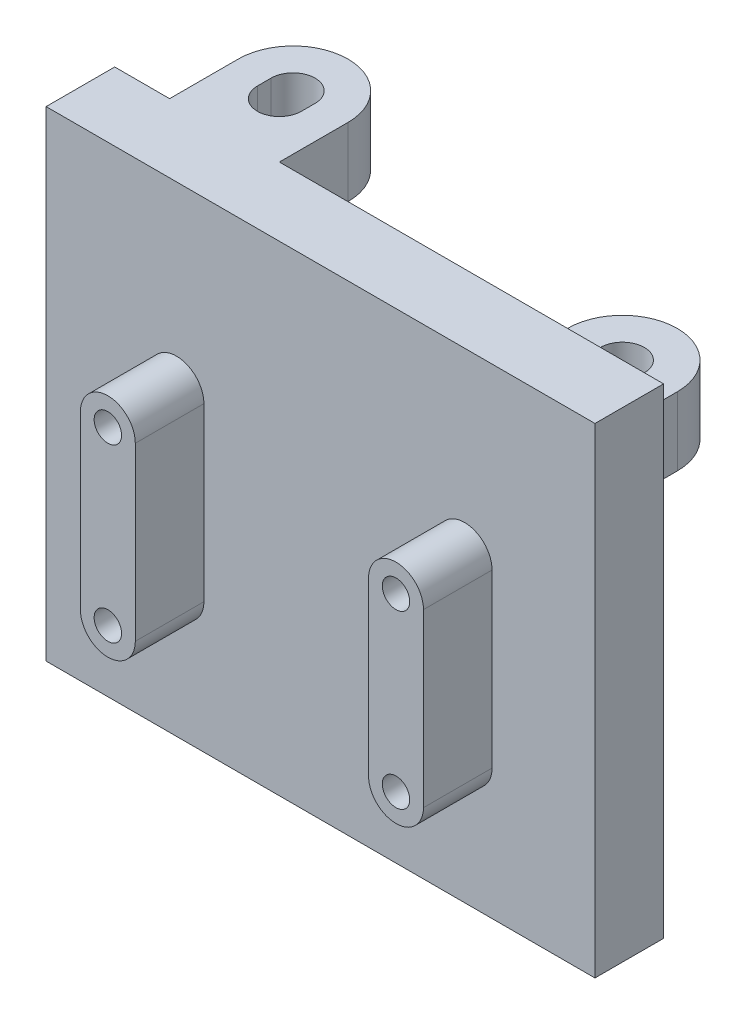
ISO-10303-21;
HEADER;
FILE_DESCRIPTION(('STEP AP214'),'2;1');
FILE_NAME('part.step','',(''),(''),'','','');
FILE_SCHEMA(('AUTOMOTIVE_DESIGN { 1 0 10303 214 1 1 1 1 }'));
ENDSEC;
DATA;
#1=APPLICATION_CONTEXT('core data for automotive mechanical design processes');
#2=APPLICATION_PROTOCOL_DEFINITION('international standard','automotive_design',2000,#1);
#3=PRODUCT_CONTEXT('',#1,'mechanical');
#4=PRODUCT('Part','Part','',(#3));
#5=PRODUCT_RELATED_PRODUCT_CATEGORY('part','',(#4));
#6=PRODUCT_DEFINITION_FORMATION('','',#4);
#7=PRODUCT_DEFINITION_CONTEXT('part definition',#1,'design');
#8=PRODUCT_DEFINITION('design','',#6,#7);
#9=PRODUCT_DEFINITION_SHAPE('','',#8);
#10=(LENGTH_UNIT() NAMED_UNIT(*) SI_UNIT(.MILLI.,.METRE.));
#11=(NAMED_UNIT(*) PLANE_ANGLE_UNIT() SI_UNIT($,.RADIAN.));
#12=(NAMED_UNIT(*) SI_UNIT($,.STERADIAN.) SOLID_ANGLE_UNIT());
#13=UNCERTAINTY_MEASURE_WITH_UNIT(LENGTH_MEASURE(1.E-05),#10,'distance_accuracy_value','');
#14=(GEOMETRIC_REPRESENTATION_CONTEXT(3) GLOBAL_UNCERTAINTY_ASSIGNED_CONTEXT((#13)) GLOBAL_UNIT_ASSIGNED_CONTEXT((#10,
#11,#12)) REPRESENTATION_CONTEXT('',''));
#15=CARTESIAN_POINT('',(0.,0.,0.));
#16=DIRECTION('',(0.,0.,1.));
#17=DIRECTION('',(1.,0.,0.));
#18=AXIS2_PLACEMENT_3D('',#15,#16,#17);
#19=CARTESIAN_POINT('',(0.,5.,5.));
#20=DIRECTION('',(0.,0.,1.));
#21=DIRECTION('',(1.,0.,0.));
#22=AXIS2_PLACEMENT_3D('',#19,#20,#21);
#23=PLANE('',#22);
#24=CARTESIAN_POINT('',(10.5,-20.5,5.));
#25=DIRECTION('',(0.,0.,1.));
#26=DIRECTION('',(1.,0.,0.));
#27=AXIS2_PLACEMENT_3D('',#24,#25,#26);
#28=CIRCLE('',#27,2.);
#29=CARTESIAN_POINT('',(12.5,-20.5,5.));
#30=VERTEX_POINT('',#29);
#31=CARTESIAN_POINT('',(8.5,-20.5,5.));
#32=VERTEX_POINT('',#31);
#33=EDGE_CURVE('E229',#30,#32,#28,.F.);
#34=ORIENTED_EDGE('',*,*,#33,.T.);
#35=DIRECTION('',(0.,-1.,0.));
#36=VECTOR('',#35,1.);
#37=CARTESIAN_POINT('',(8.50000000000001,0.,5.));
#38=LINE('',#37,#36);
#39=CARTESIAN_POINT('',(8.50000000000001,-8.,5.));
#40=VERTEX_POINT('',#39);
#41=EDGE_CURVE('E247',#40,#32,#38,.T.);
#42=ORIENTED_EDGE('',*,*,#41,.F.);
#43=CARTESIAN_POINT('',(10.5,-8.,5.));
#44=DIRECTION('',(0.,0.,1.));
#45=DIRECTION('',(1.,0.,0.));
#46=AXIS2_PLACEMENT_3D('',#43,#44,#45);
#47=CIRCLE('',#46,2.);
#48=CARTESIAN_POINT('',(12.5,-8.,5.));
#49=VERTEX_POINT('',#48);
#50=EDGE_CURVE('E55',#40,#49,#47,.F.);
#51=ORIENTED_EDGE('',*,*,#50,.T.);
#52=DIRECTION('',(0.,-1.,0.));
#53=VECTOR('',#52,1.);
#54=CARTESIAN_POINT('',(12.5,0.,5.));
#55=LINE('',#54,#53);
#56=EDGE_CURVE('E263',#49,#30,#55,.T.);
#57=ORIENTED_EDGE('',*,*,#56,.T.);
#58=EDGE_LOOP('',(#34,#42,#51,#57));
#59=FACE_BOUND('',#58,.T.);
#60=CARTESIAN_POINT('',(-10.5,-20.5,5.));
#61=DIRECTION('',(0.,0.,1.));
#62=DIRECTION('',(1.,0.,0.));
#63=AXIS2_PLACEMENT_3D('',#60,#61,#62);
#64=CIRCLE('',#63,2.);
#65=CARTESIAN_POINT('',(-12.5,-20.5,5.));
#66=VERTEX_POINT('',#65);
#67=CARTESIAN_POINT('',(-8.49999999999999,-20.5,5.));
#68=VERTEX_POINT('',#67);
#69=EDGE_CURVE('E292',#66,#68,#64,.T.);
#70=ORIENTED_EDGE('',*,*,#69,.F.);
#71=DIRECTION('',(0.,-1.,0.));
#72=VECTOR('',#71,1.);
#73=CARTESIAN_POINT('',(-12.5,0.,5.));
#74=LINE('',#73,#72);
#75=CARTESIAN_POINT('',(-12.5,-8.,5.));
#76=VERTEX_POINT('',#75);
#77=EDGE_CURVE('E234',#76,#66,#74,.T.);
#78=ORIENTED_EDGE('',*,*,#77,.F.);
#79=CARTESIAN_POINT('',(-10.5,-8.,5.));
#80=DIRECTION('',(0.,0.,1.));
#81=DIRECTION('',(1.,0.,0.));
#82=AXIS2_PLACEMENT_3D('',#79,#80,#81);
#83=CIRCLE('',#82,2.);
#84=CARTESIAN_POINT('',(-8.5,-8.,5.));
#85=VERTEX_POINT('',#84);
#86=EDGE_CURVE('E276',#85,#76,#83,.T.);
#87=ORIENTED_EDGE('',*,*,#86,.F.);
#88=DIRECTION('',(0.,-1.,0.));
#89=VECTOR('',#88,1.);
#90=CARTESIAN_POINT('',(-8.5,0.,5.));
#91=LINE('',#90,#89);
#92=EDGE_CURVE('E63',#85,#68,#91,.T.);
#93=ORIENTED_EDGE('',*,*,#92,.T.);
#94=EDGE_LOOP('',(#70,#78,#87,#93));
#95=FACE_BOUND('',#94,.T.);
#96=DIRECTION('',(-1.,0.,0.));
#97=VECTOR('',#96,1.);
#98=CARTESIAN_POINT('',(0.,5.,5.));
#99=LINE('',#98,#97);
#100=CARTESIAN_POINT('',(20.,5.,5.));
#101=VERTEX_POINT('',#100);
#102=CARTESIAN_POINT('',(-20.,5.,5.));
#103=VERTEX_POINT('',#102);
#104=EDGE_CURVE('E392',#101,#103,#99,.T.);
#105=ORIENTED_EDGE('',*,*,#104,.T.);
#106=DIRECTION('',(0.,-1.,0.));
#107=VECTOR('',#106,1.);
#108=CARTESIAN_POINT('',(-20.,0.,5.));
#109=LINE('',#108,#107);
#110=CARTESIAN_POINT('',(-20.,-30.,5.));
#111=VERTEX_POINT('',#110);
#112=EDGE_CURVE('E306',#103,#111,#109,.T.);
#113=ORIENTED_EDGE('',*,*,#112,.T.);
#114=DIRECTION('',(-1.,0.,0.));
#115=VECTOR('',#114,1.);
#116=CARTESIAN_POINT('',(0.,-30.,5.));
#117=LINE('',#116,#115);
#118=CARTESIAN_POINT('',(20.,-30.,4.99999999999999));
#119=VERTEX_POINT('',#118);
#120=EDGE_CURVE('E321',#119,#111,#117,.T.);
#121=ORIENTED_EDGE('',*,*,#120,.F.);
#122=DIRECTION('',(0.,-1.,0.));
#123=VECTOR('',#122,1.);
#124=CARTESIAN_POINT('',(20.,0.,5.));
#125=LINE('',#124,#123);
#126=EDGE_CURVE('E305',#101,#119,#125,.T.);
#127=ORIENTED_EDGE('',*,*,#126,.F.);
#128=EDGE_LOOP('',(#105,#113,#121,#127));
#129=FACE_BOUND('',#128,.T.);
#130=ADVANCED_FACE('F39',(#59,#95,#129),#23,.T.);
#131=CARTESIAN_POINT('',(0.,5.,0.));
#132=DIRECTION('',(0.,0.,-1.));
#133=DIRECTION('',(-1.,0.,0.));
#134=AXIS2_PLACEMENT_3D('',#131,#132,#133);
#135=PLANE('',#134);
#136=CARTESIAN_POINT('',(10.5,-20.5,0.));
#137=DIRECTION('',(0.,0.,-1.));
#138=DIRECTION('',(-1.,0.,0.));
#139=AXIS2_PLACEMENT_3D('',#136,#137,#138);
#140=CIRCLE('',#139,1.);
#141=CARTESIAN_POINT('',(9.5,-20.5,0.));
#142=VERTEX_POINT('',#141);
#143=EDGE_CURVE('E42',#142,#142,#140,.F.);
#144=ORIENTED_EDGE('',*,*,#143,.T.);
#145=EDGE_LOOP('',(#144));
#146=FACE_BOUND('',#145,.T.);
#147=CARTESIAN_POINT('',(-10.5,-8.,0.));
#148=DIRECTION('',(0.,0.,-1.));
#149=DIRECTION('',(-1.,0.,0.));
#150=AXIS2_PLACEMENT_3D('',#147,#148,#149);
#151=CIRCLE('',#150,1.);
#152=CARTESIAN_POINT('',(-11.5,-8.,0.));
#153=VERTEX_POINT('',#152);
#154=EDGE_CURVE('E462',#153,#153,#151,.T.);
#155=ORIENTED_EDGE('',*,*,#154,.F.);
#156=EDGE_LOOP('',(#155));
#157=FACE_BOUND('',#156,.T.);
#158=CARTESIAN_POINT('',(-10.5,-20.5,0.));
#159=DIRECTION('',(0.,0.,-1.));
#160=DIRECTION('',(-1.,0.,0.));
#161=AXIS2_PLACEMENT_3D('',#158,#159,#160);
#162=CIRCLE('',#161,1.);
#163=CARTESIAN_POINT('',(-11.5,-20.5,0.));
#164=VERTEX_POINT('',#163);
#165=EDGE_CURVE('E460',#164,#164,#162,.T.);
#166=ORIENTED_EDGE('',*,*,#165,.F.);
#167=EDGE_LOOP('',(#166));
#168=FACE_BOUND('',#167,.T.);
#169=DIRECTION('',(1.,0.,0.));
#170=VECTOR('',#169,1.);
#171=CARTESIAN_POINT('',(0.,0.,0.));
#172=LINE('',#171,#170);
#173=CARTESIAN_POINT('',(8.,0.,0.));
#174=VERTEX_POINT('',#173);
#175=CARTESIAN_POINT('',(16.,0.,0.));
#176=VERTEX_POINT('',#175);
#177=EDGE_CURVE('E374',#174,#176,#172,.T.);
#178=ORIENTED_EDGE('',*,*,#177,.F.);
#179=DIRECTION('',(0.,1.,0.));
#180=VECTOR('',#179,1.);
#181=CARTESIAN_POINT('',(8.,-5.,0.));
#182=LINE('',#181,#180);
#183=CARTESIAN_POINT('',(8.,-5.,0.));
#184=VERTEX_POINT('',#183);
#185=EDGE_CURVE('E378',#184,#174,#182,.T.);
#186=ORIENTED_EDGE('',*,*,#185,.F.);
#187=DIRECTION('',(1.,0.,0.));
#188=VECTOR('',#187,1.);
#189=CARTESIAN_POINT('',(0.,-5.,0.));
#190=LINE('',#189,#188);
#191=CARTESIAN_POINT('',(16.,-5.,0.));
#192=VERTEX_POINT('',#191);
#193=EDGE_CURVE('E327',#184,#192,#190,.T.);
#194=ORIENTED_EDGE('',*,*,#193,.T.);
#195=DIRECTION('',(0.,1.,0.));
#196=VECTOR('',#195,1.);
#197=CARTESIAN_POINT('',(16.,-5.,0.));
#198=LINE('',#197,#196);
#199=EDGE_CURVE('E375',#192,#176,#198,.T.);
#200=ORIENTED_EDGE('',*,*,#199,.T.);
#201=EDGE_LOOP('',(#178,#186,#194,#200));
#202=FACE_BOUND('',#201,.T.);
#203=CARTESIAN_POINT('',(10.5,-8.,0.));
#204=DIRECTION('',(0.,0.,-1.));
#205=DIRECTION('',(-1.,0.,0.));
#206=AXIS2_PLACEMENT_3D('',#203,#204,#205);
#207=CIRCLE('',#206,1.);
#208=CARTESIAN_POINT('',(9.5,-8.,0.));
#209=VERTEX_POINT('',#208);
#210=EDGE_CURVE('E320',#209,#209,#207,.F.);
#211=ORIENTED_EDGE('',*,*,#210,.T.);
#212=EDGE_LOOP('',(#211));
#213=FACE_BOUND('',#212,.T.);
#214=DIRECTION('',(1.,0.,0.));
#215=VECTOR('',#214,1.);
#216=CARTESIAN_POINT('',(0.,-30.,0.));
#217=LINE('',#216,#215);
#218=CARTESIAN_POINT('',(-20.,-30.,0.));
#219=VERTEX_POINT('',#218);
#220=CARTESIAN_POINT('',(20.,-30.,0.));
#221=VERTEX_POINT('',#220);
#222=EDGE_CURVE('E324',#219,#221,#217,.T.);
#223=ORIENTED_EDGE('',*,*,#222,.F.);
#224=DIRECTION('',(0.,1.,0.));
#225=VECTOR('',#224,1.);
#226=CARTESIAN_POINT('',(-20.,5.,0.));
#227=LINE('',#226,#225);
#228=CARTESIAN_POINT('',(-20.,5.,0.));
#229=VERTEX_POINT('',#228);
#230=EDGE_CURVE('E317',#219,#229,#227,.T.);
#231=ORIENTED_EDGE('',*,*,#230,.T.);
#232=DIRECTION('',(1.,0.,0.));
#233=VECTOR('',#232,1.);
#234=CARTESIAN_POINT('',(0.,5.,0.));
#235=LINE('',#234,#233);
#236=CARTESIAN_POINT('',(-16.,5.,0.));
#237=VERTEX_POINT('',#236);
#238=EDGE_CURVE('E400',#229,#237,#235,.T.);
#239=ORIENTED_EDGE('',*,*,#238,.T.);
#240=DIRECTION('',(0.,-1.,0.));
#241=VECTOR('',#240,1.);
#242=CARTESIAN_POINT('',(-16.,5.,0.));
#243=LINE('',#242,#241);
#244=CARTESIAN_POINT('',(-16.,0.,0.));
#245=VERTEX_POINT('',#244);
#246=EDGE_CURVE('E418',#237,#245,#243,.T.);
#247=ORIENTED_EDGE('',*,*,#246,.T.);
#248=DIRECTION('',(1.,0.,0.));
#249=VECTOR('',#248,1.);
#250=CARTESIAN_POINT('',(0.,0.,0.));
#251=LINE('',#250,#249);
#252=CARTESIAN_POINT('',(-8.,0.,0.));
#253=VERTEX_POINT('',#252);
#254=EDGE_CURVE('E365',#245,#253,#251,.T.);
#255=ORIENTED_EDGE('',*,*,#254,.T.);
#256=DIRECTION('',(0.,-1.,0.));
#257=VECTOR('',#256,1.);
#258=CARTESIAN_POINT('',(-8.,5.,0.));
#259=LINE('',#258,#257);
#260=CARTESIAN_POINT('',(-8.,5.,0.));
#261=VERTEX_POINT('',#260);
#262=EDGE_CURVE('E442',#261,#253,#259,.T.);
#263=ORIENTED_EDGE('',*,*,#262,.F.);
#264=CARTESIAN_POINT('',(20.,5.,0.));
#265=VERTEX_POINT('',#264);
#266=EDGE_CURVE('E395',#261,#265,#235,.T.);
#267=ORIENTED_EDGE('',*,*,#266,.T.);
#268=DIRECTION('',(0.,1.,0.));
#269=VECTOR('',#268,1.);
#270=CARTESIAN_POINT('',(20.,5.,0.));
#271=LINE('',#270,#269);
#272=EDGE_CURVE('E313',#221,#265,#271,.T.);
#273=ORIENTED_EDGE('',*,*,#272,.F.);
#274=EDGE_LOOP('',(#223,#231,#239,#247,#255,#263,#267,#273));
#275=FACE_BOUND('',#274,.T.);
#276=ADVANCED_FACE('F469',(#146,#157,#168,#202,#213,#275),#135,.T.);
#277=CARTESIAN_POINT('',(0.,5.,0.));
#278=DIRECTION('',(0.,1.,0.));
#279=DIRECTION('',(0.,0.,1.));
#280=AXIS2_PLACEMENT_3D('',#277,#278,#279);
#281=PLANE('',#280);
#282=DIRECTION('',(0.,0.,1.));
#283=VECTOR('',#282,1.);
#284=CARTESIAN_POINT('',(-10.4,5.,0.));
#285=LINE('',#284,#283);
#286=CARTESIAN_POINT('',(-10.4,5.,-4.99999999999999));
#287=VERTEX_POINT('',#286);
#288=CARTESIAN_POINT('',(-10.4,5.,-3.99999999999999));
#289=VERTEX_POINT('',#288);
#290=EDGE_CURVE('E408',#287,#289,#285,.T.);
#291=ORIENTED_EDGE('',*,*,#290,.T.);
#292=CARTESIAN_POINT('',(-12.,5.,-3.99999999999999));
#293=DIRECTION('',(0.,1.,0.));
#294=DIRECTION('',(0.,0.,1.));
#295=AXIS2_PLACEMENT_3D('',#292,#293,#294);
#296=CIRCLE('',#295,1.6);
#297=CARTESIAN_POINT('',(-13.6,5.,-3.99999999999999));
#298=VERTEX_POINT('',#297);
#299=EDGE_CURVE('E411',#289,#298,#296,.F.);
#300=ORIENTED_EDGE('',*,*,#299,.T.);
#301=DIRECTION('',(0.,0.,1.));
#302=VECTOR('',#301,1.);
#303=CARTESIAN_POINT('',(-13.6,5.,0.));
#304=LINE('',#303,#302);
#305=CARTESIAN_POINT('',(-13.6,5.,-4.99999999999999));
#306=VERTEX_POINT('',#305);
#307=EDGE_CURVE('E413',#306,#298,#304,.T.);
#308=ORIENTED_EDGE('',*,*,#307,.F.);
#309=CARTESIAN_POINT('',(-12.,5.,-4.99999999999999));
#310=DIRECTION('',(0.,1.,0.));
#311=DIRECTION('',(0.,0.,1.));
#312=AXIS2_PLACEMENT_3D('',#309,#310,#311);
#313=CIRCLE('',#312,1.6);
#314=EDGE_CURVE('E416',#306,#287,#313,.F.);
#315=ORIENTED_EDGE('',*,*,#314,.T.);
#316=EDGE_LOOP('',(#291,#300,#308,#315));
#317=FACE_BOUND('',#316,.T.);
#318=ORIENTED_EDGE('',*,*,#238,.F.);
#319=DIRECTION('',(0.,0.,1.));
#320=VECTOR('',#319,1.);
#321=CARTESIAN_POINT('',(-20.,5.,-8.99999999999999));
#322=LINE('',#321,#320);
#323=EDGE_CURVE('E309',#229,#103,#322,.T.);
#324=ORIENTED_EDGE('',*,*,#323,.T.);
#325=ORIENTED_EDGE('',*,*,#104,.F.);
#326=DIRECTION('',(0.,0.,1.));
#327=VECTOR('',#326,1.);
#328=CARTESIAN_POINT('',(20.,5.,-8.99999999999999));
#329=LINE('',#328,#327);
#330=EDGE_CURVE('E310',#265,#101,#329,.T.);
#331=ORIENTED_EDGE('',*,*,#330,.F.);
#332=ORIENTED_EDGE('',*,*,#266,.F.);
#333=DIRECTION('',(0.,0.,1.));
#334=VECTOR('',#333,1.);
#335=CARTESIAN_POINT('',(-8.,5.,0.));
#336=LINE('',#335,#334);
#337=CARTESIAN_POINT('',(-8.,5.,-4.99999999999999));
#338=VERTEX_POINT('',#337);
#339=EDGE_CURVE('E399',#338,#261,#336,.T.);
#340=ORIENTED_EDGE('',*,*,#339,.F.);
#341=CARTESIAN_POINT('',(-12.,5.,-4.99999999999999));
#342=DIRECTION('',(0.,1.,0.));
#343=DIRECTION('',(0.,0.,1.));
#344=AXIS2_PLACEMENT_3D('',#341,#342,#343);
#345=CIRCLE('',#344,4.);
#346=CARTESIAN_POINT('',(-16.,5.,-5.));
#347=VERTEX_POINT('',#346);
#348=EDGE_CURVE('E403',#338,#347,#345,.T.);
#349=ORIENTED_EDGE('',*,*,#348,.T.);
#350=DIRECTION('',(0.,0.,1.));
#351=VECTOR('',#350,1.);
#352=CARTESIAN_POINT('',(-16.,5.,0.));
#353=LINE('',#352,#351);
#354=EDGE_CURVE('E405',#347,#237,#353,.T.);
#355=ORIENTED_EDGE('',*,*,#354,.T.);
#356=EDGE_LOOP('',(#318,#324,#325,#331,#332,#340,#349,#355));
#357=FACE_BOUND('',#356,.T.);
#358=ADVANCED_FACE('F507',(#317,#357),#281,.T.);
#359=CARTESIAN_POINT('',(0.,-30.,0.));
#360=DIRECTION('',(0.,1.,0.));
#361=DIRECTION('',(0.,0.,1.));
#362=AXIS2_PLACEMENT_3D('',#359,#360,#361);
#363=PLANE('',#362);
#364=DIRECTION('',(0.,0.,1.));
#365=VECTOR('',#364,1.);
#366=CARTESIAN_POINT('',(-20.,-30.,0.));
#367=LINE('',#366,#365);
#368=EDGE_CURVE('E11',#219,#111,#367,.T.);
#369=ORIENTED_EDGE('',*,*,#368,.F.);
#370=ORIENTED_EDGE('',*,*,#222,.T.);
#371=DIRECTION('',(0.,0.,1.));
#372=VECTOR('',#371,1.);
#373=CARTESIAN_POINT('',(20.,-30.,0.));
#374=LINE('',#373,#372);
#375=EDGE_CURVE('E47',#221,#119,#374,.T.);
#376=ORIENTED_EDGE('',*,*,#375,.T.);
#377=ORIENTED_EDGE('',*,*,#120,.T.);
#378=EDGE_LOOP('',(#369,#370,#376,#377));
#379=FACE_BOUND('',#378,.T.);
#380=ADVANCED_FACE('F526',(#379),#363,.F.);
#381=CARTESIAN_POINT('',(0.,-5.,0.));
#382=DIRECTION('',(0.,1.,0.));
#383=DIRECTION('',(0.,0.,1.));
#384=AXIS2_PLACEMENT_3D('',#381,#382,#383);
#385=PLANE('',#384);
#386=CARTESIAN_POINT('',(12.,-5.,-3.99999999999999));
#387=DIRECTION('',(0.,1.,0.));
#388=DIRECTION('',(0.,0.,1.));
#389=AXIS2_PLACEMENT_3D('',#386,#387,#388);
#390=CIRCLE('',#389,1.6);
#391=CARTESIAN_POINT('',(10.4,-5.,-3.99999999999999));
#392=VERTEX_POINT('',#391);
#393=CARTESIAN_POINT('',(13.6,-5.,-3.99999999999999));
#394=VERTEX_POINT('',#393);
#395=EDGE_CURVE('E331',#392,#394,#390,.T.);
#396=ORIENTED_EDGE('',*,*,#395,.T.);
#397=DIRECTION('',(0.,0.,1.));
#398=VECTOR('',#397,1.);
#399=CARTESIAN_POINT('',(13.6,-5.,0.));
#400=LINE('',#399,#398);
#401=CARTESIAN_POINT('',(13.6,-5.,-4.99999999999999));
#402=VERTEX_POINT('',#401);
#403=EDGE_CURVE('E338',#402,#394,#400,.T.);
#404=ORIENTED_EDGE('',*,*,#403,.F.);
#405=CARTESIAN_POINT('',(12.,-5.,-4.99999999999999));
#406=DIRECTION('',(0.,1.,0.));
#407=DIRECTION('',(0.,0.,1.));
#408=AXIS2_PLACEMENT_3D('',#405,#406,#407);
#409=CIRCLE('',#408,1.6);
#410=CARTESIAN_POINT('',(10.4,-5.,-4.99999999999999));
#411=VERTEX_POINT('',#410);
#412=EDGE_CURVE('E336',#402,#411,#409,.T.);
#413=ORIENTED_EDGE('',*,*,#412,.T.);
#414=DIRECTION('',(0.,0.,1.));
#415=VECTOR('',#414,1.);
#416=CARTESIAN_POINT('',(10.4,-5.,0.));
#417=LINE('',#416,#415);
#418=EDGE_CURVE('E333',#411,#392,#417,.T.);
#419=ORIENTED_EDGE('',*,*,#418,.T.);
#420=EDGE_LOOP('',(#396,#404,#413,#419));
#421=FACE_BOUND('',#420,.T.);
#422=ORIENTED_EDGE('',*,*,#193,.F.);
#423=DIRECTION('',(0.,0.,1.));
#424=VECTOR('',#423,1.);
#425=CARTESIAN_POINT('',(8.,-5.,0.));
#426=LINE('',#425,#424);
#427=CARTESIAN_POINT('',(8.,-5.,-4.99999999999999));
#428=VERTEX_POINT('',#427);
#429=EDGE_CURVE('E344',#428,#184,#426,.T.);
#430=ORIENTED_EDGE('',*,*,#429,.F.);
#431=CARTESIAN_POINT('',(12.,-5.,-4.99999999999999));
#432=DIRECTION('',(0.,1.,0.));
#433=DIRECTION('',(0.,0.,1.));
#434=AXIS2_PLACEMENT_3D('',#431,#432,#433);
#435=CIRCLE('',#434,4.);
#436=CARTESIAN_POINT('',(16.,-5.,-5.));
#437=VERTEX_POINT('',#436);
#438=EDGE_CURVE('E341',#428,#437,#435,.F.);
#439=ORIENTED_EDGE('',*,*,#438,.T.);
#440=DIRECTION('',(0.,0.,1.));
#441=VECTOR('',#440,1.);
#442=CARTESIAN_POINT('',(16.,-5.,0.));
#443=LINE('',#442,#441);
#444=EDGE_CURVE('E347',#437,#192,#443,.T.);
#445=ORIENTED_EDGE('',*,*,#444,.T.);
#446=EDGE_LOOP('',(#422,#430,#439,#445));
#447=FACE_BOUND('',#446,.T.);
#448=ADVANCED_FACE('F541',(#421,#447),#385,.F.);
#449=CARTESIAN_POINT('',(0.,0.,0.));
#450=DIRECTION('',(0.,1.,0.));
#451=DIRECTION('',(0.,0.,1.));
#452=AXIS2_PLACEMENT_3D('',#449,#450,#451);
#453=PLANE('',#452);
#454=DIRECTION('',(0.,0.,1.));
#455=VECTOR('',#454,1.);
#456=CARTESIAN_POINT('',(-10.4,0.,0.));
#457=LINE('',#456,#455);
#458=CARTESIAN_POINT('',(-10.4,0.,-4.99999999999999));
#459=VERTEX_POINT('',#458);
#460=CARTESIAN_POINT('',(-10.4,0.,-3.99999999999999));
#461=VERTEX_POINT('',#460);
#462=EDGE_CURVE('E428',#459,#461,#457,.T.);
#463=ORIENTED_EDGE('',*,*,#462,.F.);
#464=CARTESIAN_POINT('',(-12.,0.,-4.99999999999999));
#465=DIRECTION('',(0.,1.,0.));
#466=DIRECTION('',(0.,0.,1.));
#467=AXIS2_PLACEMENT_3D('',#464,#465,#466);
#468=CIRCLE('',#467,1.6);
#469=CARTESIAN_POINT('',(-13.6,0.,-4.99999999999999));
#470=VERTEX_POINT('',#469);
#471=EDGE_CURVE('E396',#470,#459,#468,.F.);
#472=ORIENTED_EDGE('',*,*,#471,.F.);
#473=DIRECTION('',(0.,0.,1.));
#474=VECTOR('',#473,1.);
#475=CARTESIAN_POINT('',(-13.6,0.,0.));
#476=LINE('',#475,#474);
#477=CARTESIAN_POINT('',(-13.6,0.,-3.99999999999999));
#478=VERTEX_POINT('',#477);
#479=EDGE_CURVE('E434',#470,#478,#476,.T.);
#480=ORIENTED_EDGE('',*,*,#479,.T.);
#481=CARTESIAN_POINT('',(-12.,0.,-3.99999999999999));
#482=DIRECTION('',(0.,1.,0.));
#483=DIRECTION('',(0.,0.,1.));
#484=AXIS2_PLACEMENT_3D('',#481,#482,#483);
#485=CIRCLE('',#484,1.6);
#486=EDGE_CURVE('E431',#461,#478,#485,.F.);
#487=ORIENTED_EDGE('',*,*,#486,.F.);
#488=EDGE_LOOP('',(#463,#472,#480,#487));
#489=FACE_BOUND('',#488,.T.);
#490=ORIENTED_EDGE('',*,*,#254,.F.);
#491=DIRECTION('',(0.,0.,1.));
#492=VECTOR('',#491,1.);
#493=CARTESIAN_POINT('',(-16.,0.,0.));
#494=LINE('',#493,#492);
#495=CARTESIAN_POINT('',(-16.,0.,-5.));
#496=VERTEX_POINT('',#495);
#497=EDGE_CURVE('E425',#496,#245,#494,.T.);
#498=ORIENTED_EDGE('',*,*,#497,.F.);
#499=CARTESIAN_POINT('',(-12.,0.,-4.99999999999999));
#500=DIRECTION('',(0.,1.,0.));
#501=DIRECTION('',(0.,0.,1.));
#502=AXIS2_PLACEMENT_3D('',#499,#500,#501);
#503=CIRCLE('',#502,4.);
#504=CARTESIAN_POINT('',(-8.,0.,-4.99999999999999));
#505=VERTEX_POINT('',#504);
#506=EDGE_CURVE('E423',#505,#496,#503,.T.);
#507=ORIENTED_EDGE('',*,*,#506,.F.);
#508=DIRECTION('',(0.,0.,1.));
#509=VECTOR('',#508,1.);
#510=CARTESIAN_POINT('',(-8.,0.,0.));
#511=LINE('',#510,#509);
#512=EDGE_CURVE('E420',#505,#253,#511,.T.);
#513=ORIENTED_EDGE('',*,*,#512,.T.);
#514=EDGE_LOOP('',(#490,#498,#507,#513));
#515=FACE_BOUND('',#514,.T.);
#516=ADVANCED_FACE('F543',(#489,#515),#453,.F.);
#517=CARTESIAN_POINT('',(-10.4,5.,0.));
#518=DIRECTION('',(1.,0.,0.));
#519=DIRECTION('',(0.,0.,-1.));
#520=AXIS2_PLACEMENT_3D('',#517,#518,#519);
#521=PLANE('',#520);
#522=ORIENTED_EDGE('',*,*,#462,.T.);
#523=DIRECTION('',(0.,-1.,0.));
#524=VECTOR('',#523,1.);
#525=CARTESIAN_POINT('',(-10.4,5.,-3.99999999999999));
#526=LINE('',#525,#524);
#527=EDGE_CURVE('E368',#289,#461,#526,.T.);
#528=ORIENTED_EDGE('',*,*,#527,.F.);
#529=ORIENTED_EDGE('',*,*,#290,.F.);
#530=DIRECTION('',(0.,-1.,0.));
#531=VECTOR('',#530,1.);
#532=CARTESIAN_POINT('',(-10.4,5.,-4.99999999999999));
#533=LINE('',#532,#531);
#534=EDGE_CURVE('E438',#287,#459,#533,.T.);
#535=ORIENTED_EDGE('',*,*,#534,.T.);
#536=EDGE_LOOP('',(#522,#528,#529,#535));
#537=FACE_BOUND('',#536,.T.);
#538=ADVANCED_FACE('F579',(#537),#521,.F.);
#539=CARTESIAN_POINT('',(-12.,5.,-3.99999999999999));
#540=DIRECTION('',(0.,-1.,0.));
#541=DIRECTION('',(0.,0.,-1.));
#542=AXIS2_PLACEMENT_3D('',#539,#540,#541);
#543=CYLINDRICAL_SURFACE('',#542,1.6);
#544=ORIENTED_EDGE('',*,*,#486,.T.);
#545=DIRECTION('',(0.,-1.,0.));
#546=VECTOR('',#545,1.);
#547=CARTESIAN_POINT('',(-13.6,5.,-3.99999999999999));
#548=LINE('',#547,#546);
#549=EDGE_CURVE('E444',#298,#478,#548,.T.);
#550=ORIENTED_EDGE('',*,*,#549,.F.);
#551=ORIENTED_EDGE('',*,*,#299,.F.);
#552=ORIENTED_EDGE('',*,*,#527,.T.);
#553=EDGE_LOOP('',(#544,#550,#551,#552));
#554=FACE_BOUND('',#553,.T.);
#555=ADVANCED_FACE('F589',(#554),#543,.F.);
#556=CARTESIAN_POINT('',(-13.6,5.,0.));
#557=DIRECTION('',(1.,0.,0.));
#558=DIRECTION('',(0.,0.,-1.));
#559=AXIS2_PLACEMENT_3D('',#556,#557,#558);
#560=PLANE('',#559);
#561=ORIENTED_EDGE('',*,*,#479,.F.);
#562=DIRECTION('',(0.,-1.,0.));
#563=VECTOR('',#562,1.);
#564=CARTESIAN_POINT('',(-13.6,5.,-4.99999999999999));
#565=LINE('',#564,#563);
#566=EDGE_CURVE('E441',#306,#470,#565,.T.);
#567=ORIENTED_EDGE('',*,*,#566,.F.);
#568=ORIENTED_EDGE('',*,*,#307,.T.);
#569=ORIENTED_EDGE('',*,*,#549,.T.);
#570=EDGE_LOOP('',(#561,#567,#568,#569));
#571=FACE_BOUND('',#570,.T.);
#572=ADVANCED_FACE('F585',(#571),#560,.T.);
#573=CARTESIAN_POINT('',(-8.,5.,0.));
#574=DIRECTION('',(1.,0.,0.));
#575=DIRECTION('',(0.,0.,-1.));
#576=AXIS2_PLACEMENT_3D('',#573,#574,#575);
#577=PLANE('',#576);
#578=ORIENTED_EDGE('',*,*,#512,.F.);
#579=DIRECTION('',(0.,-1.,0.));
#580=VECTOR('',#579,1.);
#581=CARTESIAN_POINT('',(-8.,5.,-4.99999999999999));
#582=LINE('',#581,#580);
#583=EDGE_CURVE('E453',#338,#505,#582,.T.);
#584=ORIENTED_EDGE('',*,*,#583,.F.);
#585=ORIENTED_EDGE('',*,*,#339,.T.);
#586=ORIENTED_EDGE('',*,*,#262,.T.);
#587=EDGE_LOOP('',(#578,#584,#585,#586));
#588=FACE_BOUND('',#587,.T.);
#589=ADVANCED_FACE('F588',(#588),#577,.T.);
#590=CARTESIAN_POINT('',(-12.,5.,-4.99999999999999));
#591=DIRECTION('',(0.,-1.,0.));
#592=DIRECTION('',(0.,0.,-1.));
#593=AXIS2_PLACEMENT_3D('',#590,#591,#592);
#594=CYLINDRICAL_SURFACE('',#593,4.);
#595=ORIENTED_EDGE('',*,*,#506,.T.);
#596=DIRECTION('',(0.,-1.,0.));
#597=VECTOR('',#596,1.);
#598=CARTESIAN_POINT('',(-16.,5.,-5.));
#599=LINE('',#598,#597);
#600=EDGE_CURVE('E450',#347,#496,#599,.T.);
#601=ORIENTED_EDGE('',*,*,#600,.F.);
#602=ORIENTED_EDGE('',*,*,#348,.F.);
#603=ORIENTED_EDGE('',*,*,#583,.T.);
#604=EDGE_LOOP('',(#595,#601,#602,#603));
#605=FACE_BOUND('',#604,.T.);
#606=ADVANCED_FACE('F599',(#605),#594,.T.);
#607=CARTESIAN_POINT('',(-16.,5.,0.));
#608=DIRECTION('',(1.,0.,0.));
#609=DIRECTION('',(0.,0.,-1.));
#610=AXIS2_PLACEMENT_3D('',#607,#608,#609);
#611=PLANE('',#610);
#612=ORIENTED_EDGE('',*,*,#497,.T.);
#613=ORIENTED_EDGE('',*,*,#246,.F.);
#614=ORIENTED_EDGE('',*,*,#354,.F.);
#615=ORIENTED_EDGE('',*,*,#600,.T.);
#616=EDGE_LOOP('',(#612,#613,#614,#615));
#617=FACE_BOUND('',#616,.T.);
#618=ADVANCED_FACE('F583',(#617),#611,.F.);
#619=CARTESIAN_POINT('',(-12.,5.,-4.99999999999999));
#620=DIRECTION('',(0.,-1.,0.));
#621=DIRECTION('',(0.,0.,-1.));
#622=AXIS2_PLACEMENT_3D('',#619,#620,#621);
#623=CYLINDRICAL_SURFACE('',#622,1.6);
#624=ORIENTED_EDGE('',*,*,#471,.T.);
#625=ORIENTED_EDGE('',*,*,#534,.F.);
#626=ORIENTED_EDGE('',*,*,#314,.F.);
#627=ORIENTED_EDGE('',*,*,#566,.T.);
#628=EDGE_LOOP('',(#624,#625,#626,#627));
#629=FACE_BOUND('',#628,.T.);
#630=ADVANCED_FACE('F558',(#629),#623,.F.);
#631=CARTESIAN_POINT('',(12.,-5.,-4.99999999999999));
#632=DIRECTION('',(0.,1.,0.));
#633=DIRECTION('',(0.,0.,1.));
#634=AXIS2_PLACEMENT_3D('',#631,#632,#633);
#635=CYLINDRICAL_SURFACE('',#634,4.);
#636=CARTESIAN_POINT('',(12.,0.,-4.99999999999999));
#637=DIRECTION('',(0.,1.,0.));
#638=DIRECTION('',(0.,0.,1.));
#639=AXIS2_PLACEMENT_3D('',#636,#637,#638);
#640=CIRCLE('',#639,4.);
#641=CARTESIAN_POINT('',(8.,0.,-4.99999999999999));
#642=VERTEX_POINT('',#641);
#643=CARTESIAN_POINT('',(16.,0.,-5.));
#644=VERTEX_POINT('',#643);
#645=EDGE_CURVE('E359',#642,#644,#640,.F.);
#646=ORIENTED_EDGE('',*,*,#645,.T.);
#647=DIRECTION('',(0.,1.,0.));
#648=VECTOR('',#647,1.);
#649=CARTESIAN_POINT('',(16.,-5.,-5.));
#650=LINE('',#649,#648);
#651=EDGE_CURVE('E371',#437,#644,#650,.T.);
#652=ORIENTED_EDGE('',*,*,#651,.F.);
#653=ORIENTED_EDGE('',*,*,#438,.F.);
#654=DIRECTION('',(0.,1.,0.));
#655=VECTOR('',#654,1.);
#656=CARTESIAN_POINT('',(8.,-5.,-4.99999999999999));
#657=LINE('',#656,#655);
#658=EDGE_CURVE('E381',#428,#642,#657,.T.);
#659=ORIENTED_EDGE('',*,*,#658,.T.);
#660=EDGE_LOOP('',(#646,#652,#653,#659));
#661=FACE_BOUND('',#660,.T.);
#662=ADVANCED_FACE('F550',(#661),#635,.T.);
#663=CARTESIAN_POINT('',(16.,-5.,0.));
#664=DIRECTION('',(-1.,0.,0.));
#665=DIRECTION('',(0.,0.,1.));
#666=AXIS2_PLACEMENT_3D('',#663,#664,#665);
#667=PLANE('',#666);
#668=DIRECTION('',(0.,0.,1.));
#669=VECTOR('',#668,1.);
#670=CARTESIAN_POINT('',(16.,0.,0.));
#671=LINE('',#670,#669);
#672=EDGE_CURVE('E334',#644,#176,#671,.T.);
#673=ORIENTED_EDGE('',*,*,#672,.T.);
#674=ORIENTED_EDGE('',*,*,#199,.F.);
#675=ORIENTED_EDGE('',*,*,#444,.F.);
#676=ORIENTED_EDGE('',*,*,#651,.T.);
#677=EDGE_LOOP('',(#673,#674,#675,#676));
#678=FACE_BOUND('',#677,.T.);
#679=ADVANCED_FACE('F546',(#678),#667,.F.);
#680=CARTESIAN_POINT('',(12.,-5.,-3.99999999999999));
#681=DIRECTION('',(0.,1.,0.));
#682=DIRECTION('',(0.,0.,1.));
#683=AXIS2_PLACEMENT_3D('',#680,#681,#682);
#684=CYLINDRICAL_SURFACE('',#683,1.6);
#685=CARTESIAN_POINT('',(12.,0.,-3.99999999999999));
#686=DIRECTION('',(0.,1.,0.));
#687=DIRECTION('',(0.,0.,1.));
#688=AXIS2_PLACEMENT_3D('',#685,#686,#687);
#689=CIRCLE('',#688,1.6);
#690=CARTESIAN_POINT('',(10.4,0.,-3.99999999999999));
#691=VERTEX_POINT('',#690);
#692=CARTESIAN_POINT('',(13.6,0.,-3.99999999999999));
#693=VERTEX_POINT('',#692);
#694=EDGE_CURVE('E330',#691,#693,#689,.T.);
#695=ORIENTED_EDGE('',*,*,#694,.T.);
#696=DIRECTION('',(0.,1.,0.));
#697=VECTOR('',#696,1.);
#698=CARTESIAN_POINT('',(13.6,-5.,-3.99999999999999));
#699=LINE('',#698,#697);
#700=EDGE_CURVE('E383',#394,#693,#699,.T.);
#701=ORIENTED_EDGE('',*,*,#700,.F.);
#702=ORIENTED_EDGE('',*,*,#395,.F.);
#703=DIRECTION('',(0.,1.,0.));
#704=VECTOR('',#703,1.);
#705=CARTESIAN_POINT('',(10.4,-5.,-3.99999999999999));
#706=LINE('',#705,#704);
#707=EDGE_CURVE('E349',#392,#691,#706,.T.);
#708=ORIENTED_EDGE('',*,*,#707,.T.);
#709=EDGE_LOOP('',(#695,#701,#702,#708));
#710=FACE_BOUND('',#709,.T.);
#711=ADVANCED_FACE('F549',(#710),#684,.F.);
#712=CARTESIAN_POINT('',(13.6,-5.,0.));
#713=DIRECTION('',(-1.,0.,0.));
#714=DIRECTION('',(0.,0.,1.));
#715=AXIS2_PLACEMENT_3D('',#712,#713,#714);
#716=PLANE('',#715);
#717=DIRECTION('',(0.,0.,1.));
#718=VECTOR('',#717,1.);
#719=CARTESIAN_POINT('',(13.6,0.,0.));
#720=LINE('',#719,#718);
#721=CARTESIAN_POINT('',(13.6,0.,-4.99999999999999));
#722=VERTEX_POINT('',#721);
#723=EDGE_CURVE('E356',#722,#693,#720,.T.);
#724=ORIENTED_EDGE('',*,*,#723,.F.);
#725=DIRECTION('',(0.,1.,0.));
#726=VECTOR('',#725,1.);
#727=CARTESIAN_POINT('',(13.6,-5.,-4.99999999999999));
#728=LINE('',#727,#726);
#729=EDGE_CURVE('E385',#402,#722,#728,.T.);
#730=ORIENTED_EDGE('',*,*,#729,.F.);
#731=ORIENTED_EDGE('',*,*,#403,.T.);
#732=ORIENTED_EDGE('',*,*,#700,.T.);
#733=EDGE_LOOP('',(#724,#730,#731,#732));
#734=FACE_BOUND('',#733,.T.);
#735=ADVANCED_FACE('F560',(#734),#716,.T.);
#736=CARTESIAN_POINT('',(12.,-5.,-4.99999999999999));
#737=DIRECTION('',(0.,1.,0.));
#738=DIRECTION('',(0.,0.,1.));
#739=AXIS2_PLACEMENT_3D('',#736,#737,#738);
#740=CYLINDRICAL_SURFACE('',#739,1.6);
#741=CARTESIAN_POINT('',(12.,0.,-4.99999999999999));
#742=DIRECTION('',(0.,1.,0.));
#743=DIRECTION('',(0.,0.,1.));
#744=AXIS2_PLACEMENT_3D('',#741,#742,#743);
#745=CIRCLE('',#744,1.6);
#746=CARTESIAN_POINT('',(10.4,0.,-4.99999999999999));
#747=VERTEX_POINT('',#746);
#748=EDGE_CURVE('E354',#722,#747,#745,.T.);
#749=ORIENTED_EDGE('',*,*,#748,.T.);
#750=DIRECTION('',(0.,1.,0.));
#751=VECTOR('',#750,1.);
#752=CARTESIAN_POINT('',(10.4,-5.,-4.99999999999999));
#753=LINE('',#752,#751);
#754=EDGE_CURVE('E387',#411,#747,#753,.T.);
#755=ORIENTED_EDGE('',*,*,#754,.F.);
#756=ORIENTED_EDGE('',*,*,#412,.F.);
#757=ORIENTED_EDGE('',*,*,#729,.T.);
#758=EDGE_LOOP('',(#749,#755,#756,#757));
#759=FACE_BOUND('',#758,.T.);
#760=ADVANCED_FACE('F563',(#759),#740,.F.);
#761=CARTESIAN_POINT('',(10.4,-5.,0.));
#762=DIRECTION('',(-1.,0.,0.));
#763=DIRECTION('',(0.,0.,1.));
#764=AXIS2_PLACEMENT_3D('',#761,#762,#763);
#765=PLANE('',#764);
#766=DIRECTION('',(0.,0.,1.));
#767=VECTOR('',#766,1.);
#768=CARTESIAN_POINT('',(10.4,0.,0.));
#769=LINE('',#768,#767);
#770=EDGE_CURVE('E352',#747,#691,#769,.T.);
#771=ORIENTED_EDGE('',*,*,#770,.T.);
#772=ORIENTED_EDGE('',*,*,#707,.F.);
#773=ORIENTED_EDGE('',*,*,#418,.F.);
#774=ORIENTED_EDGE('',*,*,#754,.T.);
#775=EDGE_LOOP('',(#771,#772,#773,#774));
#776=FACE_BOUND('',#775,.T.);
#777=ADVANCED_FACE('F554',(#776),#765,.F.);
#778=CARTESIAN_POINT('',(8.,-5.,0.));
#779=DIRECTION('',(-1.,0.,0.));
#780=DIRECTION('',(0.,0.,1.));
#781=AXIS2_PLACEMENT_3D('',#778,#779,#780);
#782=PLANE('',#781);
#783=DIRECTION('',(0.,0.,1.));
#784=VECTOR('',#783,1.);
#785=CARTESIAN_POINT('',(8.,0.,0.));
#786=LINE('',#785,#784);
#787=EDGE_CURVE('E362',#642,#174,#786,.T.);
#788=ORIENTED_EDGE('',*,*,#787,.F.);
#789=ORIENTED_EDGE('',*,*,#658,.F.);
#790=ORIENTED_EDGE('',*,*,#429,.T.);
#791=ORIENTED_EDGE('',*,*,#185,.T.);
#792=EDGE_LOOP('',(#788,#789,#790,#791));
#793=FACE_BOUND('',#792,.T.);
#794=ADVANCED_FACE('F533',(#793),#782,.T.);
#795=CARTESIAN_POINT('',(0.,0.,0.));
#796=DIRECTION('',(0.,1.,0.));
#797=DIRECTION('',(0.,0.,1.));
#798=AXIS2_PLACEMENT_3D('',#795,#796,#797);
#799=PLANE('',#798);
#800=ORIENTED_EDGE('',*,*,#694,.F.);
#801=ORIENTED_EDGE('',*,*,#770,.F.);
#802=ORIENTED_EDGE('',*,*,#748,.F.);
#803=ORIENTED_EDGE('',*,*,#723,.T.);
#804=EDGE_LOOP('',(#800,#801,#802,#803));
#805=FACE_BOUND('',#804,.T.);
#806=ORIENTED_EDGE('',*,*,#787,.T.);
#807=ORIENTED_EDGE('',*,*,#177,.T.);
#808=ORIENTED_EDGE('',*,*,#672,.F.);
#809=ORIENTED_EDGE('',*,*,#645,.F.);
#810=EDGE_LOOP('',(#806,#807,#808,#809));
#811=FACE_BOUND('',#810,.T.);
#812=ADVANCED_FACE('F529',(#805,#811),#799,.T.);
#813=CARTESIAN_POINT('',(20.,0.,-8.99999999999999));
#814=DIRECTION('',(-1.,0.,0.));
#815=DIRECTION('',(0.,-1.,0.));
#816=AXIS2_PLACEMENT_3D('',#813,#814,#815);
#817=PLANE('',#816);
#818=ORIENTED_EDGE('',*,*,#272,.T.);
#819=ORIENTED_EDGE('',*,*,#330,.T.);
#820=ORIENTED_EDGE('',*,*,#126,.T.);
#821=ORIENTED_EDGE('',*,*,#375,.F.);
#822=EDGE_LOOP('',(#818,#819,#820,#821));
#823=FACE_BOUND('',#822,.T.);
#824=ADVANCED_FACE('F497',(#823),#817,.F.);
#825=CARTESIAN_POINT('',(-20.,0.,-8.99999999999999));
#826=DIRECTION('',(-1.,0.,0.));
#827=DIRECTION('',(0.,-1.,0.));
#828=AXIS2_PLACEMENT_3D('',#825,#826,#827);
#829=PLANE('',#828);
#830=ORIENTED_EDGE('',*,*,#368,.T.);
#831=ORIENTED_EDGE('',*,*,#112,.F.);
#832=ORIENTED_EDGE('',*,*,#323,.F.);
#833=ORIENTED_EDGE('',*,*,#230,.F.);
#834=EDGE_LOOP('',(#830,#831,#832,#833));
#835=FACE_BOUND('',#834,.T.);
#836=ADVANCED_FACE('F488',(#835),#829,.T.);
#837=CARTESIAN_POINT('',(10.5,-8.,-8.99999999999999));
#838=DIRECTION('',(0.,0.,1.));
#839=DIRECTION('',(1.,0.,0.));
#840=AXIS2_PLACEMENT_3D('',#837,#838,#839);
#841=CYLINDRICAL_SURFACE('',#840,1.);
#842=ORIENTED_EDGE('',*,*,#210,.F.);
#843=EDGE_LOOP('',(#842));
#844=FACE_BOUND('',#843,.T.);
#845=CARTESIAN_POINT('',(10.5,-8.,10.));
#846=DIRECTION('',(0.,0.,1.));
#847=DIRECTION('',(1.,0.,0.));
#848=AXIS2_PLACEMENT_3D('',#845,#846,#847);
#849=CIRCLE('',#848,1.);
#850=CARTESIAN_POINT('',(11.5,-8.,10.));
#851=VERTEX_POINT('',#850);
#852=EDGE_CURVE('E258',#851,#851,#849,.F.);
#853=ORIENTED_EDGE('',*,*,#852,.F.);
#854=EDGE_LOOP('',(#853));
#855=FACE_BOUND('',#854,.T.);
#856=ADVANCED_FACE('F485',(#844,#855),#841,.F.);
#857=CARTESIAN_POINT('',(-10.5,-20.5,-8.99999999999999));
#858=DIRECTION('',(0.,0.,1.));
#859=DIRECTION('',(1.,0.,0.));
#860=AXIS2_PLACEMENT_3D('',#857,#858,#859);
#861=CYLINDRICAL_SURFACE('',#860,1.);
#862=ORIENTED_EDGE('',*,*,#165,.T.);
#863=EDGE_LOOP('',(#862));
#864=FACE_BOUND('',#863,.T.);
#865=CARTESIAN_POINT('',(-10.5,-20.5,10.));
#866=DIRECTION('',(0.,0.,1.));
#867=DIRECTION('',(1.,0.,0.));
#868=AXIS2_PLACEMENT_3D('',#865,#866,#867);
#869=CIRCLE('',#868,1.);
#870=CARTESIAN_POINT('',(-9.49999999999999,-20.5,10.));
#871=VERTEX_POINT('',#870);
#872=EDGE_CURVE('E275',#871,#871,#869,.T.);
#873=ORIENTED_EDGE('',*,*,#872,.T.);
#874=EDGE_LOOP('',(#873));
#875=FACE_BOUND('',#874,.T.);
#876=ADVANCED_FACE('F487',(#864,#875),#861,.F.);
#877=CARTESIAN_POINT('',(-10.5,-8.,-8.99999999999999));
#878=DIRECTION('',(0.,0.,1.));
#879=DIRECTION('',(1.,0.,0.));
#880=AXIS2_PLACEMENT_3D('',#877,#878,#879);
#881=CYLINDRICAL_SURFACE('',#880,1.);
#882=ORIENTED_EDGE('',*,*,#154,.T.);
#883=EDGE_LOOP('',(#882));
#884=FACE_BOUND('',#883,.T.);
#885=CARTESIAN_POINT('',(-10.5,-8.,10.));
#886=DIRECTION('',(0.,0.,1.));
#887=DIRECTION('',(1.,0.,0.));
#888=AXIS2_PLACEMENT_3D('',#885,#886,#887);
#889=CIRCLE('',#888,1.);
#890=CARTESIAN_POINT('',(-9.5,-8.,10.));
#891=VERTEX_POINT('',#890);
#892=EDGE_CURVE('E272',#891,#891,#889,.T.);
#893=ORIENTED_EDGE('',*,*,#892,.T.);
#894=EDGE_LOOP('',(#893));
#895=FACE_BOUND('',#894,.T.);
#896=ADVANCED_FACE('F476',(#884,#895),#881,.F.);
#897=CARTESIAN_POINT('',(10.5,-20.5,-8.99999999999999));
#898=DIRECTION('',(0.,0.,1.));
#899=DIRECTION('',(1.,0.,0.));
#900=AXIS2_PLACEMENT_3D('',#897,#898,#899);
#901=CYLINDRICAL_SURFACE('',#900,1.);
#902=ORIENTED_EDGE('',*,*,#143,.F.);
#903=EDGE_LOOP('',(#902));
#904=FACE_BOUND('',#903,.T.);
#905=CARTESIAN_POINT('',(10.5,-20.5,10.));
#906=DIRECTION('',(0.,0.,1.));
#907=DIRECTION('',(1.,0.,0.));
#908=AXIS2_PLACEMENT_3D('',#905,#906,#907);
#909=CIRCLE('',#908,1.);
#910=CARTESIAN_POINT('',(11.5,-20.5,10.));
#911=VERTEX_POINT('',#910);
#912=EDGE_CURVE('E255',#911,#911,#909,.F.);
#913=ORIENTED_EDGE('',*,*,#912,.F.);
#914=EDGE_LOOP('',(#913));
#915=FACE_BOUND('',#914,.T.);
#916=ADVANCED_FACE('F472',(#904,#915),#901,.F.);
#917=CARTESIAN_POINT('',(-12.5,0.,10.));
#918=DIRECTION('',(1.,0.,0.));
#919=DIRECTION('',(0.,1.,0.));
#920=AXIS2_PLACEMENT_3D('',#917,#918,#919);
#921=PLANE('',#920);
#922=ORIENTED_EDGE('',*,*,#77,.T.);
#923=DIRECTION('',(0.,0.,-1.));
#924=VECTOR('',#923,1.);
#925=CARTESIAN_POINT('',(-12.5,-20.5,10.));
#926=LINE('',#925,#924);
#927=CARTESIAN_POINT('',(-12.5,-20.5,10.));
#928=VERTEX_POINT('',#927);
#929=EDGE_CURVE('E303',#928,#66,#926,.T.);
#930=ORIENTED_EDGE('',*,*,#929,.F.);
#931=DIRECTION('',(0.,-1.,0.));
#932=VECTOR('',#931,1.);
#933=CARTESIAN_POINT('',(-12.5,0.,10.));
#934=LINE('',#933,#932);
#935=CARTESIAN_POINT('',(-12.5,-8.,10.));
#936=VERTEX_POINT('',#935);
#937=EDGE_CURVE('E279',#936,#928,#934,.T.);
#938=ORIENTED_EDGE('',*,*,#937,.F.);
#939=DIRECTION('',(0.,0.,-1.));
#940=VECTOR('',#939,1.);
#941=CARTESIAN_POINT('',(-12.5,-8.,10.));
#942=LINE('',#941,#940);
#943=EDGE_CURVE('E289',#936,#76,#942,.T.);
#944=ORIENTED_EDGE('',*,*,#943,.T.);
#945=EDGE_LOOP('',(#922,#930,#938,#944));
#946=FACE_BOUND('',#945,.T.);
#947=ADVANCED_FACE('F475',(#946),#921,.F.);
#948=CARTESIAN_POINT('',(-10.5,-20.5,10.));
#949=DIRECTION('',(0.,0.,-1.));
#950=DIRECTION('',(-1.,0.,0.));
#951=AXIS2_PLACEMENT_3D('',#948,#949,#950);
#952=CYLINDRICAL_SURFACE('',#951,2.);
#953=ORIENTED_EDGE('',*,*,#69,.T.);
#954=DIRECTION('',(0.,0.,-1.));
#955=VECTOR('',#954,1.);
#956=CARTESIAN_POINT('',(-8.49999999999999,-20.5,10.));
#957=LINE('',#956,#955);
#958=CARTESIAN_POINT('',(-8.49999999999999,-20.5,10.));
#959=VERTEX_POINT('',#958);
#960=EDGE_CURVE('E301',#959,#68,#957,.T.);
#961=ORIENTED_EDGE('',*,*,#960,.F.);
#962=CARTESIAN_POINT('',(-10.5,-20.5,10.));
#963=DIRECTION('',(0.,0.,1.));
#964=DIRECTION('',(1.,0.,0.));
#965=AXIS2_PLACEMENT_3D('',#962,#963,#964);
#966=CIRCLE('',#965,2.);
#967=EDGE_CURVE('E282',#928,#959,#966,.T.);
#968=ORIENTED_EDGE('',*,*,#967,.F.);
#969=ORIENTED_EDGE('',*,*,#929,.T.);
#970=EDGE_LOOP('',(#953,#961,#968,#969));
#971=FACE_BOUND('',#970,.T.);
#972=ADVANCED_FACE('F706',(#971),#952,.T.);
#973=CARTESIAN_POINT('',(-8.5,0.,10.));
#974=DIRECTION('',(1.,0.,0.));
#975=DIRECTION('',(0.,1.,0.));
#976=AXIS2_PLACEMENT_3D('',#973,#974,#975);
#977=PLANE('',#976);
#978=ORIENTED_EDGE('',*,*,#92,.F.);
#979=DIRECTION('',(0.,0.,-1.));
#980=VECTOR('',#979,1.);
#981=CARTESIAN_POINT('',(-8.5,-8.,10.));
#982=LINE('',#981,#980);
#983=CARTESIAN_POINT('',(-8.5,-8.,10.));
#984=VERTEX_POINT('',#983);
#985=EDGE_CURVE('E299',#984,#85,#982,.T.);
#986=ORIENTED_EDGE('',*,*,#985,.F.);
#987=DIRECTION('',(0.,-1.,0.));
#988=VECTOR('',#987,1.);
#989=CARTESIAN_POINT('',(-8.5,0.,10.));
#990=LINE('',#989,#988);
#991=EDGE_CURVE('E284',#984,#959,#990,.T.);
#992=ORIENTED_EDGE('',*,*,#991,.T.);
#993=ORIENTED_EDGE('',*,*,#960,.T.);
#994=EDGE_LOOP('',(#978,#986,#992,#993));
#995=FACE_BOUND('',#994,.T.);
#996=ADVANCED_FACE('F716',(#995),#977,.T.);
#997=CARTESIAN_POINT('',(-10.5,-8.,10.));
#998=DIRECTION('',(0.,0.,-1.));
#999=DIRECTION('',(-1.,0.,0.));
#1000=AXIS2_PLACEMENT_3D('',#997,#998,#999);
#1001=CYLINDRICAL_SURFACE('',#1000,2.);
#1002=ORIENTED_EDGE('',*,*,#86,.T.);
#1003=ORIENTED_EDGE('',*,*,#943,.F.);
#1004=CARTESIAN_POINT('',(-10.5,-8.,10.));
#1005=DIRECTION('',(0.,0.,1.));
#1006=DIRECTION('',(1.,0.,0.));
#1007=AXIS2_PLACEMENT_3D('',#1004,#1005,#1006);
#1008=CIRCLE('',#1007,2.);
#1009=EDGE_CURVE('E287',#984,#936,#1008,.T.);
#1010=ORIENTED_EDGE('',*,*,#1009,.F.);
#1011=ORIENTED_EDGE('',*,*,#985,.T.);
#1012=EDGE_LOOP('',(#1002,#1003,#1010,#1011));
#1013=FACE_BOUND('',#1012,.T.);
#1014=ADVANCED_FACE('F726',(#1013),#1001,.T.);
#1015=CARTESIAN_POINT('',(0.,0.,10.));
#1016=DIRECTION('',(0.,0.,1.));
#1017=DIRECTION('',(1.,0.,0.));
#1018=AXIS2_PLACEMENT_3D('',#1015,#1016,#1017);
#1019=PLANE('',#1018);
#1020=ORIENTED_EDGE('',*,*,#892,.F.);
#1021=EDGE_LOOP('',(#1020));
#1022=FACE_BOUND('',#1021,.T.);
#1023=ORIENTED_EDGE('',*,*,#872,.F.);
#1024=EDGE_LOOP('',(#1023));
#1025=FACE_BOUND('',#1024,.T.);
#1026=ORIENTED_EDGE('',*,*,#937,.T.);
#1027=ORIENTED_EDGE('',*,*,#967,.T.);
#1028=ORIENTED_EDGE('',*,*,#991,.F.);
#1029=ORIENTED_EDGE('',*,*,#1009,.T.);
#1030=EDGE_LOOP('',(#1026,#1027,#1028,#1029));
#1031=FACE_BOUND('',#1030,.T.);
#1032=ADVANCED_FACE('F735',(#1022,#1025,#1031),#1019,.T.);
#1033=CARTESIAN_POINT('',(10.5,-20.5,10.));
#1034=DIRECTION('',(0.,0.,-1.));
#1035=DIRECTION('',(-1.,0.,0.));
#1036=AXIS2_PLACEMENT_3D('',#1033,#1034,#1035);
#1037=CYLINDRICAL_SURFACE('',#1036,2.);
#1038=ORIENTED_EDGE('',*,*,#33,.F.);
#1039=DIRECTION('',(0.,0.,-1.));
#1040=VECTOR('',#1039,1.);
#1041=CARTESIAN_POINT('',(12.5,-20.5,10.));
#1042=LINE('',#1041,#1040);
#1043=CARTESIAN_POINT('',(12.5,-20.5,10.));
#1044=VERTEX_POINT('',#1043);
#1045=EDGE_CURVE('E224',#1044,#30,#1042,.T.);
#1046=ORIENTED_EDGE('',*,*,#1045,.F.);
#1047=CARTESIAN_POINT('',(10.5,-20.5,10.));
#1048=DIRECTION('',(0.,0.,1.));
#1049=DIRECTION('',(1.,0.,0.));
#1050=AXIS2_PLACEMENT_3D('',#1047,#1048,#1049);
#1051=CIRCLE('',#1050,2.);
#1052=CARTESIAN_POINT('',(8.5,-20.5,10.));
#1053=VERTEX_POINT('',#1052);
#1054=EDGE_CURVE('E227',#1044,#1053,#1051,.F.);
#1055=ORIENTED_EDGE('',*,*,#1054,.T.);
#1056=DIRECTION('',(0.,0.,-1.));
#1057=VECTOR('',#1056,1.);
#1058=CARTESIAN_POINT('',(8.5,-20.5,10.));
#1059=LINE('',#1058,#1057);
#1060=EDGE_CURVE('E261',#1053,#32,#1059,.T.);
#1061=ORIENTED_EDGE('',*,*,#1060,.T.);
#1062=EDGE_LOOP('',(#1038,#1046,#1055,#1061));
#1063=FACE_BOUND('',#1062,.T.);
#1064=ADVANCED_FACE('F226',(#1063),#1037,.T.);
#1065=CARTESIAN_POINT('',(12.5,0.,10.));
#1066=DIRECTION('',(1.,0.,0.));
#1067=DIRECTION('',(0.,1.,0.));
#1068=AXIS2_PLACEMENT_3D('',#1065,#1066,#1067);
#1069=PLANE('',#1068);
#1070=ORIENTED_EDGE('',*,*,#56,.F.);
#1071=DIRECTION('',(0.,0.,-1.));
#1072=VECTOR('',#1071,1.);
#1073=CARTESIAN_POINT('',(12.5,-8.,10.));
#1074=LINE('',#1073,#1072);
#1075=CARTESIAN_POINT('',(12.5,-8.,10.));
#1076=VERTEX_POINT('',#1075);
#1077=EDGE_CURVE('E235',#1076,#49,#1074,.T.);
#1078=ORIENTED_EDGE('',*,*,#1077,.F.);
#1079=DIRECTION('',(0.,-1.,0.));
#1080=VECTOR('',#1079,1.);
#1081=CARTESIAN_POINT('',(12.5,0.,10.));
#1082=LINE('',#1081,#1080);
#1083=EDGE_CURVE('E242',#1076,#1044,#1082,.T.);
#1084=ORIENTED_EDGE('',*,*,#1083,.T.);
#1085=ORIENTED_EDGE('',*,*,#1045,.T.);
#1086=EDGE_LOOP('',(#1070,#1078,#1084,#1085));
#1087=FACE_BOUND('',#1086,.T.);
#1088=ADVANCED_FACE('F249',(#1087),#1069,.T.);
#1089=CARTESIAN_POINT('',(10.5,-8.,10.));
#1090=DIRECTION('',(0.,0.,-1.));
#1091=DIRECTION('',(-1.,0.,0.));
#1092=AXIS2_PLACEMENT_3D('',#1089,#1090,#1091);
#1093=CYLINDRICAL_SURFACE('',#1092,2.);
#1094=ORIENTED_EDGE('',*,*,#50,.F.);
#1095=DIRECTION('',(0.,0.,-1.));
#1096=VECTOR('',#1095,1.);
#1097=CARTESIAN_POINT('',(8.50000000000001,-8.,10.));
#1098=LINE('',#1097,#1096);
#1099=CARTESIAN_POINT('',(8.50000000000001,-8.,10.));
#1100=VERTEX_POINT('',#1099);
#1101=EDGE_CURVE('E269',#1100,#40,#1098,.T.);
#1102=ORIENTED_EDGE('',*,*,#1101,.F.);
#1103=CARTESIAN_POINT('',(10.5,-8.,10.));
#1104=DIRECTION('',(0.,0.,1.));
#1105=DIRECTION('',(1.,0.,0.));
#1106=AXIS2_PLACEMENT_3D('',#1103,#1104,#1105);
#1107=CIRCLE('',#1106,2.);
#1108=EDGE_CURVE('E250',#1100,#1076,#1107,.F.);
#1109=ORIENTED_EDGE('',*,*,#1108,.T.);
#1110=ORIENTED_EDGE('',*,*,#1077,.T.);
#1111=EDGE_LOOP('',(#1094,#1102,#1109,#1110));
#1112=FACE_BOUND('',#1111,.T.);
#1113=ADVANCED_FACE('F762',(#1112),#1093,.T.);
#1114=CARTESIAN_POINT('',(8.50000000000001,0.,10.));
#1115=DIRECTION('',(1.,0.,0.));
#1116=DIRECTION('',(0.,1.,0.));
#1117=AXIS2_PLACEMENT_3D('',#1114,#1115,#1116);
#1118=PLANE('',#1117);
#1119=ORIENTED_EDGE('',*,*,#41,.T.);
#1120=ORIENTED_EDGE('',*,*,#1060,.F.);
#1121=DIRECTION('',(0.,-1.,0.));
#1122=VECTOR('',#1121,1.);
#1123=CARTESIAN_POINT('',(8.50000000000001,0.,10.));
#1124=LINE('',#1123,#1122);
#1125=EDGE_CURVE('E245',#1100,#1053,#1124,.T.);
#1126=ORIENTED_EDGE('',*,*,#1125,.F.);
#1127=ORIENTED_EDGE('',*,*,#1101,.T.);
#1128=EDGE_LOOP('',(#1119,#1120,#1126,#1127));
#1129=FACE_BOUND('',#1128,.T.);
#1130=ADVANCED_FACE('F481',(#1129),#1118,.F.);
#1131=CARTESIAN_POINT('',(0.,0.,10.));
#1132=DIRECTION('',(0.,0.,1.));
#1133=DIRECTION('',(1.,0.,0.));
#1134=AXIS2_PLACEMENT_3D('',#1131,#1132,#1133);
#1135=PLANE('',#1134);
#1136=ORIENTED_EDGE('',*,*,#1054,.F.);
#1137=ORIENTED_EDGE('',*,*,#1083,.F.);
#1138=ORIENTED_EDGE('',*,*,#1108,.F.);
#1139=ORIENTED_EDGE('',*,*,#1125,.T.);
#1140=EDGE_LOOP('',(#1136,#1137,#1138,#1139));
#1141=FACE_BOUND('',#1140,.T.);
#1142=ORIENTED_EDGE('',*,*,#912,.T.);
#1143=EDGE_LOOP('',(#1142));
#1144=FACE_BOUND('',#1143,.T.);
#1145=ORIENTED_EDGE('',*,*,#852,.T.);
#1146=EDGE_LOOP('',(#1145));
#1147=FACE_BOUND('',#1146,.T.);
#1148=ADVANCED_FACE('F239',(#1141,#1144,#1147),#1135,.T.);
#1149=CLOSED_SHELL('',(#130,#276,#358,#380,#448,#516,#538,#555,#572,#589,#606,#618,#630,#662,
#679,#711,#735,#760,#777,#794,#812,#824,#836,#856,#876,#896,#916,#947,#972,#996,#1014,#1032,
#1064,#1088,#1113,#1130,#1148));
#1150=MANIFOLD_SOLID_BREP('B2',#1149);
#1151=ADVANCED_BREP_SHAPE_REPRESENTATION('',(#18,#1150),#14);
#1152=SHAPE_DEFINITION_REPRESENTATION(#9,#1151);
ENDSEC;
END-ISO-10303-21;
